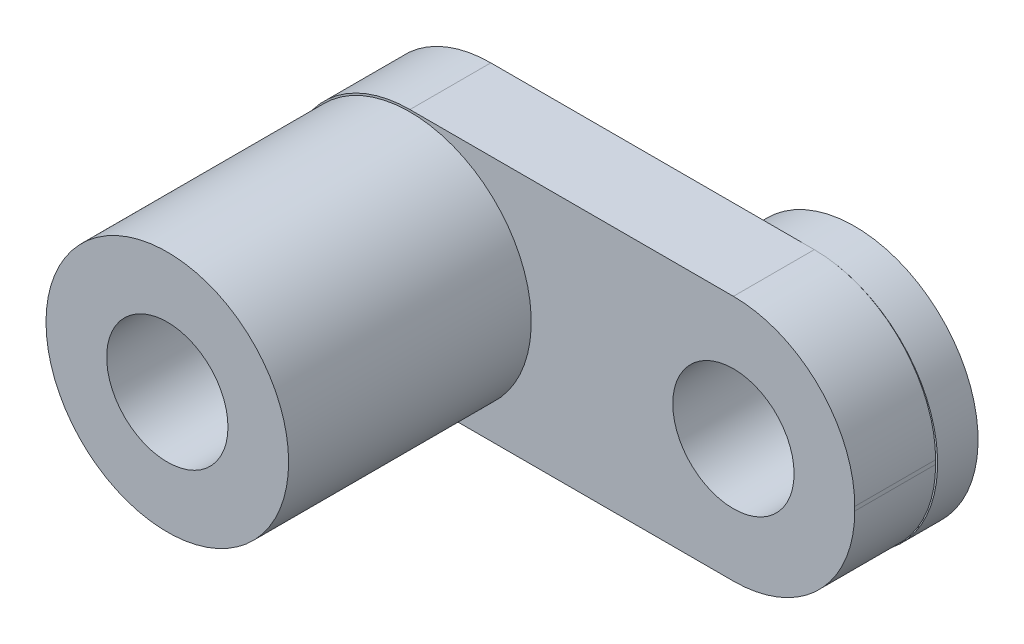
ISO-10303-21;
HEADER;
FILE_DESCRIPTION(('STEP AP214'),'2;1');
FILE_NAME('part.step','',(''),(''),'','','');
FILE_SCHEMA(('AUTOMOTIVE_DESIGN { 1 0 10303 214 1 1 1 1 }'));
ENDSEC;
DATA;
#1=APPLICATION_CONTEXT('core data for automotive mechanical design processes');
#2=APPLICATION_PROTOCOL_DEFINITION('international standard','automotive_design',2000,#1);
#3=PRODUCT_CONTEXT('',#1,'mechanical');
#4=PRODUCT('Part','Part','',(#3));
#5=PRODUCT_RELATED_PRODUCT_CATEGORY('part','',(#4));
#6=PRODUCT_DEFINITION_FORMATION('','',#4);
#7=PRODUCT_DEFINITION_CONTEXT('part definition',#1,'design');
#8=PRODUCT_DEFINITION('design','',#6,#7);
#9=PRODUCT_DEFINITION_SHAPE('','',#8);
#10=(LENGTH_UNIT() NAMED_UNIT(*) SI_UNIT(.MILLI.,.METRE.));
#11=(NAMED_UNIT(*) PLANE_ANGLE_UNIT() SI_UNIT($,.RADIAN.));
#12=(NAMED_UNIT(*) SI_UNIT($,.STERADIAN.) SOLID_ANGLE_UNIT());
#13=UNCERTAINTY_MEASURE_WITH_UNIT(LENGTH_MEASURE(1.E-05),#10,'distance_accuracy_value','');
#14=(GEOMETRIC_REPRESENTATION_CONTEXT(3) GLOBAL_UNCERTAINTY_ASSIGNED_CONTEXT((#13)) GLOBAL_UNIT_ASSIGNED_CONTEXT((#10,
#11,#12)) REPRESENTATION_CONTEXT('',''));
#15=CARTESIAN_POINT('',(0.,0.,0.));
#16=DIRECTION('',(0.,0.,1.));
#17=DIRECTION('',(1.,0.,0.));
#18=AXIS2_PLACEMENT_3D('',#15,#16,#17);
#19=CARTESIAN_POINT('',(3.,3.1,0.));
#20=DIRECTION('',(0.,0.,-1.));
#21=DIRECTION('',(-1.,0.,0.));
#22=AXIS2_PLACEMENT_3D('',#19,#20,#21);
#23=PLANE('',#22);
#24=CARTESIAN_POINT('',(3.,3.05,0.));
#25=DIRECTION('',(0.,0.,-1.));
#26=DIRECTION('',(-1.,0.,0.));
#27=AXIS2_PLACEMENT_3D('',#24,#25,#26);
#28=CIRCLE('',#27,1.5);
#29=CARTESIAN_POINT('',(1.5,3.05,0.));
#30=VERTEX_POINT('',#29);
#31=EDGE_CURVE('E118',#30,#30,#28,.T.);
#32=ORIENTED_EDGE('',*,*,#31,.F.);
#33=EDGE_LOOP('',(#32));
#34=FACE_BOUND('',#33,.T.);
#35=DIRECTION('',(-1.,0.,0.));
#36=VECTOR('',#35,1.);
#37=CARTESIAN_POINT('',(3.00000000000002,6.1,0.));
#38=LINE('',#37,#36);
#39=CARTESIAN_POINT('',(11.,6.1,0.));
#40=VERTEX_POINT('',#39);
#41=CARTESIAN_POINT('',(3.00000000000002,6.1,0.));
#42=VERTEX_POINT('',#41);
#43=EDGE_CURVE('E127',#40,#42,#38,.T.);
#44=ORIENTED_EDGE('',*,*,#43,.F.);
#45=CARTESIAN_POINT('',(11.,3.05,0.));
#46=DIRECTION('',(0.,0.,-1.));
#47=DIRECTION('',(-1.,0.,0.));
#48=AXIS2_PLACEMENT_3D('',#45,#46,#47);
#49=CIRCLE('',#48,3.05);
#50=CARTESIAN_POINT('',(11.,0.,0.));
#51=VERTEX_POINT('',#50);
#52=EDGE_CURVE('E11',#40,#51,#49,.F.);
#53=ORIENTED_EDGE('',*,*,#52,.T.);
#54=DIRECTION('',(1.,0.,0.));
#55=VECTOR('',#54,1.);
#56=CARTESIAN_POINT('',(3.00000000000002,0.,0.));
#57=LINE('',#56,#55);
#58=CARTESIAN_POINT('',(3.00000000000002,0.,0.));
#59=VERTEX_POINT('',#58);
#60=EDGE_CURVE('E188',#59,#51,#57,.T.);
#61=ORIENTED_EDGE('',*,*,#60,.F.);
#62=CARTESIAN_POINT('',(3.,3.,0.));
#63=DIRECTION('',(0.,0.,1.));
#64=DIRECTION('',(-1.,0.,0.));
#65=AXIS2_PLACEMENT_3D('',#62,#63,#64);
#66=CIRCLE('',#65,3.);
#67=CARTESIAN_POINT('',(0.,3.00000000000002,0.));
#68=VERTEX_POINT('',#67);
#69=EDGE_CURVE('E180',#68,#59,#66,.T.);
#70=ORIENTED_EDGE('',*,*,#69,.F.);
#71=DIRECTION('',(0.,-1.,0.));
#72=VECTOR('',#71,1.);
#73=CARTESIAN_POINT('',(0.,3.00000000000002,0.));
#74=LINE('',#73,#72);
#75=CARTESIAN_POINT('',(0.,3.09999999999998,0.));
#76=VERTEX_POINT('',#75);
#77=EDGE_CURVE('E174',#76,#68,#74,.T.);
#78=ORIENTED_EDGE('',*,*,#77,.F.);
#79=CARTESIAN_POINT('',(3.,3.1,0.));
#80=DIRECTION('',(0.,0.,1.));
#81=DIRECTION('',(-1.,0.,0.));
#82=AXIS2_PLACEMENT_3D('',#79,#80,#81);
#83=CIRCLE('',#82,3.);
#84=EDGE_CURVE('E137',#42,#76,#83,.T.);
#85=ORIENTED_EDGE('',*,*,#84,.F.);
#86=EDGE_LOOP('',(#44,#53,#61,#70,#78,#85));
#87=FACE_BOUND('',#86,.T.);
#88=ADVANCED_FACE('F36',(#34,#87),#23,.T.);
#89=CARTESIAN_POINT('',(3.,3.1,2.));
#90=DIRECTION('',(0.,0.,-1.));
#91=DIRECTION('',(-1.,0.,0.));
#92=AXIS2_PLACEMENT_3D('',#89,#90,#91);
#93=PLANE('',#92);
#94=CARTESIAN_POINT('',(11.,3.05,2.));
#95=DIRECTION('',(0.,0.,-1.));
#96=DIRECTION('',(-1.,0.,0.));
#97=AXIS2_PLACEMENT_3D('',#94,#95,#96);
#98=CIRCLE('',#97,1.5);
#99=CARTESIAN_POINT('',(9.5,3.05,2.));
#100=VERTEX_POINT('',#99);
#101=EDGE_CURVE('E218',#100,#100,#98,.T.);
#102=ORIENTED_EDGE('',*,*,#101,.T.);
#103=EDGE_LOOP('',(#102));
#104=FACE_BOUND('',#103,.T.);
#105=DIRECTION('',(0.,-1.,0.));
#106=VECTOR('',#105,1.);
#107=CARTESIAN_POINT('',(0.,3.00000000000002,2.));
#108=LINE('',#107,#106);
#109=CARTESIAN_POINT('',(0.,3.09999999999998,2.));
#110=VERTEX_POINT('',#109);
#111=CARTESIAN_POINT('',(0.,3.05,2.));
#112=VERTEX_POINT('',#111);
#113=EDGE_CURVE('E144',#110,#112,#108,.T.);
#114=ORIENTED_EDGE('',*,*,#113,.T.);
#115=CARTESIAN_POINT('',(3.,3.05,2.));
#116=DIRECTION('',(0.,0.,1.));
#117=DIRECTION('',(1.,0.,0.));
#118=AXIS2_PLACEMENT_3D('',#115,#116,#117);
#119=CIRCLE('',#118,3.);
#120=EDGE_CURVE('E183',#112,#112,#119,.T.);
#121=ORIENTED_EDGE('',*,*,#120,.F.);
#122=CARTESIAN_POINT('',(0.,3.00000000000002,2.));
#123=VERTEX_POINT('',#122);
#124=EDGE_CURVE('E140',#112,#123,#108,.T.);
#125=ORIENTED_EDGE('',*,*,#124,.T.);
#126=CARTESIAN_POINT('',(3.,3.,2.));
#127=DIRECTION('',(0.,0.,1.));
#128=DIRECTION('',(-1.,0.,0.));
#129=AXIS2_PLACEMENT_3D('',#126,#127,#128);
#130=CIRCLE('',#129,3.);
#131=CARTESIAN_POINT('',(3.00000000000002,0.,2.));
#132=VERTEX_POINT('',#131);
#133=EDGE_CURVE('E146',#123,#132,#130,.T.);
#134=ORIENTED_EDGE('',*,*,#133,.T.);
#135=DIRECTION('',(1.,0.,0.));
#136=VECTOR('',#135,1.);
#137=CARTESIAN_POINT('',(3.00000000000002,0.,2.));
#138=LINE('',#137,#136);
#139=CARTESIAN_POINT('',(11.,0.,2.));
#140=VERTEX_POINT('',#139);
#141=EDGE_CURVE('E148',#132,#140,#138,.T.);
#142=ORIENTED_EDGE('',*,*,#141,.T.);
#143=CARTESIAN_POINT('',(11.,3.,2.));
#144=DIRECTION('',(0.,0.,1.));
#145=DIRECTION('',(1.,0.,0.));
#146=AXIS2_PLACEMENT_3D('',#143,#144,#145);
#147=CIRCLE('',#146,3.);
#148=CARTESIAN_POINT('',(14.,3.00000000000002,2.));
#149=VERTEX_POINT('',#148);
#150=EDGE_CURVE('E150',#140,#149,#147,.T.);
#151=ORIENTED_EDGE('',*,*,#150,.T.);
#152=DIRECTION('',(0.,1.,0.));
#153=VECTOR('',#152,1.);
#154=CARTESIAN_POINT('',(14.,3.00000000000002,2.));
#155=LINE('',#154,#153);
#156=CARTESIAN_POINT('',(14.,3.09999999999998,2.));
#157=VERTEX_POINT('',#156);
#158=EDGE_CURVE('E152',#149,#157,#155,.T.);
#159=ORIENTED_EDGE('',*,*,#158,.T.);
#160=CARTESIAN_POINT('',(11.,3.1,2.));
#161=DIRECTION('',(0.,0.,1.));
#162=DIRECTION('',(-1.,0.,0.));
#163=AXIS2_PLACEMENT_3D('',#160,#161,#162);
#164=CIRCLE('',#163,3.);
#165=CARTESIAN_POINT('',(11.,6.1,2.));
#166=VERTEX_POINT('',#165);
#167=EDGE_CURVE('E56',#157,#166,#164,.T.);
#168=ORIENTED_EDGE('',*,*,#167,.T.);
#169=DIRECTION('',(-1.,0.,0.));
#170=VECTOR('',#169,1.);
#171=CARTESIAN_POINT('',(3.00000000000002,6.1,2.));
#172=LINE('',#171,#170);
#173=CARTESIAN_POINT('',(3.00000000000002,6.1,2.));
#174=VERTEX_POINT('',#173);
#175=EDGE_CURVE('E51',#166,#174,#172,.T.);
#176=ORIENTED_EDGE('',*,*,#175,.T.);
#177=CARTESIAN_POINT('',(3.,3.1,2.));
#178=DIRECTION('',(0.,0.,1.));
#179=DIRECTION('',(-1.,0.,0.));
#180=AXIS2_PLACEMENT_3D('',#177,#178,#179);
#181=CIRCLE('',#180,3.);
#182=EDGE_CURVE('E138',#174,#110,#181,.T.);
#183=ORIENTED_EDGE('',*,*,#182,.T.);
#184=EDGE_LOOP('',(#114,#121,#125,#134,#142,#151,#159,#168,#176,#183));
#185=FACE_BOUND('',#184,.T.);
#186=ADVANCED_FACE('F208',(#104,#185),#93,.F.);
#187=CARTESIAN_POINT('',(3.,3.1,2.));
#188=DIRECTION('',(0.,0.,-1.));
#189=DIRECTION('',(-1.,0.,0.));
#190=AXIS2_PLACEMENT_3D('',#187,#188,#189);
#191=CYLINDRICAL_SURFACE('',#190,3.);
#192=ORIENTED_EDGE('',*,*,#84,.T.);
#193=DIRECTION('',(0.,0.,-1.));
#194=VECTOR('',#193,1.);
#195=CARTESIAN_POINT('',(0.,3.09999999999998,2.));
#196=LINE('',#195,#194);
#197=EDGE_CURVE('E44',#110,#76,#196,.T.);
#198=ORIENTED_EDGE('',*,*,#197,.F.);
#199=ORIENTED_EDGE('',*,*,#182,.F.);
#200=DIRECTION('',(0.,0.,-1.));
#201=VECTOR('',#200,1.);
#202=CARTESIAN_POINT('',(3.00000000000002,6.1,2.));
#203=LINE('',#202,#201);
#204=EDGE_CURVE('E133',#174,#42,#203,.T.);
#205=ORIENTED_EDGE('',*,*,#204,.T.);
#206=EDGE_LOOP('',(#192,#198,#199,#205));
#207=FACE_BOUND('',#206,.T.);
#208=ADVANCED_FACE('F38',(#207),#191,.T.);
#209=CARTESIAN_POINT('',(0.,3.00000000000002,2.));
#210=DIRECTION('',(1.,0.,0.));
#211=DIRECTION('',(0.,0.,-1.));
#212=AXIS2_PLACEMENT_3D('',#209,#210,#211);
#213=PLANE('',#212);
#214=ORIENTED_EDGE('',*,*,#77,.T.);
#215=DIRECTION('',(0.,0.,-1.));
#216=VECTOR('',#215,1.);
#217=CARTESIAN_POINT('',(0.,3.00000000000002,2.));
#218=LINE('',#217,#216);
#219=EDGE_CURVE('E167',#123,#68,#218,.T.);
#220=ORIENTED_EDGE('',*,*,#219,.F.);
#221=ORIENTED_EDGE('',*,*,#124,.F.);
#222=ORIENTED_EDGE('',*,*,#113,.F.);
#223=ORIENTED_EDGE('',*,*,#197,.T.);
#224=EDGE_LOOP('',(#214,#220,#221,#222,#223));
#225=FACE_BOUND('',#224,.T.);
#226=ADVANCED_FACE('F172',(#225),#213,.F.);
#227=CARTESIAN_POINT('',(3.,3.,2.));
#228=DIRECTION('',(0.,0.,-1.));
#229=DIRECTION('',(-1.,0.,0.));
#230=AXIS2_PLACEMENT_3D('',#227,#228,#229);
#231=CYLINDRICAL_SURFACE('',#230,3.);
#232=ORIENTED_EDGE('',*,*,#69,.T.);
#233=DIRECTION('',(0.,0.,-1.));
#234=VECTOR('',#233,1.);
#235=CARTESIAN_POINT('',(3.00000000000002,0.,2.));
#236=LINE('',#235,#234);
#237=EDGE_CURVE('E164',#132,#59,#236,.T.);
#238=ORIENTED_EDGE('',*,*,#237,.F.);
#239=ORIENTED_EDGE('',*,*,#133,.F.);
#240=ORIENTED_EDGE('',*,*,#219,.T.);
#241=EDGE_LOOP('',(#232,#238,#239,#240));
#242=FACE_BOUND('',#241,.T.);
#243=ADVANCED_FACE('F204',(#242),#231,.T.);
#244=CARTESIAN_POINT('',(3.00000000000002,0.,2.));
#245=DIRECTION('',(0.,1.,0.));
#246=DIRECTION('',(0.,0.,1.));
#247=AXIS2_PLACEMENT_3D('',#244,#245,#246);
#248=PLANE('',#247);
#249=ORIENTED_EDGE('',*,*,#60,.T.);
#250=DIRECTION('',(0.,0.,-1.));
#251=VECTOR('',#250,1.);
#252=CARTESIAN_POINT('',(11.,0.,2.));
#253=LINE('',#252,#251);
#254=EDGE_CURVE('E161',#140,#51,#253,.T.);
#255=ORIENTED_EDGE('',*,*,#254,.F.);
#256=ORIENTED_EDGE('',*,*,#141,.F.);
#257=ORIENTED_EDGE('',*,*,#237,.T.);
#258=EDGE_LOOP('',(#249,#255,#256,#257));
#259=FACE_BOUND('',#258,.T.);
#260=ADVANCED_FACE('F200',(#259),#248,.F.);
#261=CARTESIAN_POINT('',(11.,3.,2.));
#262=DIRECTION('',(0.,0.,-1.));
#263=DIRECTION('',(-1.,0.,0.));
#264=AXIS2_PLACEMENT_3D('',#261,#262,#263);
#265=CYLINDRICAL_SURFACE('',#264,3.);
#266=CARTESIAN_POINT('',(11.,3.,0.));
#267=DIRECTION('',(0.,0.,1.));
#268=DIRECTION('',(1.,0.,0.));
#269=AXIS2_PLACEMENT_3D('',#266,#267,#268);
#270=CIRCLE('',#269,3.);
#271=CARTESIAN_POINT('',(14.,3.00000000000002,0.));
#272=VERTEX_POINT('',#271);
#273=EDGE_CURVE('E116',#51,#272,#270,.T.);
#274=ORIENTED_EDGE('',*,*,#273,.T.);
#275=DIRECTION('',(0.,0.,-1.));
#276=VECTOR('',#275,1.);
#277=CARTESIAN_POINT('',(14.,3.00000000000002,2.));
#278=LINE('',#277,#276);
#279=EDGE_CURVE('E158',#149,#272,#278,.T.);
#280=ORIENTED_EDGE('',*,*,#279,.F.);
#281=ORIENTED_EDGE('',*,*,#150,.F.);
#282=ORIENTED_EDGE('',*,*,#254,.T.);
#283=EDGE_LOOP('',(#274,#280,#281,#282));
#284=FACE_BOUND('',#283,.T.);
#285=ADVANCED_FACE('F195',(#284),#265,.T.);
#286=CARTESIAN_POINT('',(14.,3.00000000000002,2.));
#287=DIRECTION('',(-1.,0.,0.));
#288=DIRECTION('',(0.,0.,1.));
#289=AXIS2_PLACEMENT_3D('',#286,#287,#288);
#290=PLANE('',#289);
#291=DIRECTION('',(0.,1.,0.));
#292=VECTOR('',#291,1.);
#293=CARTESIAN_POINT('',(14.,3.00000000000002,0.));
#294=LINE('',#293,#292);
#295=CARTESIAN_POINT('',(14.,3.09999999999998,0.));
#296=VERTEX_POINT('',#295);
#297=EDGE_CURVE('E128',#272,#296,#294,.T.);
#298=ORIENTED_EDGE('',*,*,#297,.T.);
#299=DIRECTION('',(0.,0.,-1.));
#300=VECTOR('',#299,1.);
#301=CARTESIAN_POINT('',(14.,3.09999999999998,2.));
#302=LINE('',#301,#300);
#303=EDGE_CURVE('E126',#157,#296,#302,.T.);
#304=ORIENTED_EDGE('',*,*,#303,.F.);
#305=ORIENTED_EDGE('',*,*,#158,.F.);
#306=ORIENTED_EDGE('',*,*,#279,.T.);
#307=EDGE_LOOP('',(#298,#304,#305,#306));
#308=FACE_BOUND('',#307,.T.);
#309=ADVANCED_FACE('F191',(#308),#290,.F.);
#310=CARTESIAN_POINT('',(11.,3.1,2.));
#311=DIRECTION('',(0.,0.,-1.));
#312=DIRECTION('',(-1.,0.,0.));
#313=AXIS2_PLACEMENT_3D('',#310,#311,#312);
#314=CYLINDRICAL_SURFACE('',#313,3.);
#315=CARTESIAN_POINT('',(11.,3.1,0.));
#316=DIRECTION('',(0.,0.,1.));
#317=DIRECTION('',(-1.,0.,0.));
#318=AXIS2_PLACEMENT_3D('',#315,#316,#317);
#319=CIRCLE('',#318,3.);
#320=EDGE_CURVE('E113',#296,#40,#319,.T.);
#321=ORIENTED_EDGE('',*,*,#320,.T.);
#322=DIRECTION('',(0.,0.,-1.));
#323=VECTOR('',#322,1.);
#324=CARTESIAN_POINT('',(11.,6.1,2.));
#325=LINE('',#324,#323);
#326=EDGE_CURVE('E124',#166,#40,#325,.T.);
#327=ORIENTED_EDGE('',*,*,#326,.F.);
#328=ORIENTED_EDGE('',*,*,#167,.F.);
#329=ORIENTED_EDGE('',*,*,#303,.T.);
#330=EDGE_LOOP('',(#321,#327,#328,#329));
#331=FACE_BOUND('',#330,.T.);
#332=ADVANCED_FACE('F123',(#331),#314,.T.);
#333=CARTESIAN_POINT('',(3.00000000000002,6.1,2.));
#334=DIRECTION('',(0.,-1.,0.));
#335=DIRECTION('',(0.,0.,-1.));
#336=AXIS2_PLACEMENT_3D('',#333,#334,#335);
#337=PLANE('',#336);
#338=ORIENTED_EDGE('',*,*,#43,.T.);
#339=ORIENTED_EDGE('',*,*,#204,.F.);
#340=ORIENTED_EDGE('',*,*,#175,.F.);
#341=ORIENTED_EDGE('',*,*,#326,.T.);
#342=EDGE_LOOP('',(#338,#339,#340,#341));
#343=FACE_BOUND('',#342,.T.);
#344=ADVANCED_FACE('F131',(#343),#337,.F.);
#345=CARTESIAN_POINT('',(3.,3.05,8.));
#346=DIRECTION('',(0.,0.,-1.));
#347=DIRECTION('',(-1.,0.,0.));
#348=AXIS2_PLACEMENT_3D('',#345,#346,#347);
#349=CYLINDRICAL_SURFACE('',#348,3.);
#350=CARTESIAN_POINT('',(3.,3.05,8.));
#351=DIRECTION('',(0.,0.,1.));
#352=DIRECTION('',(1.,0.,0.));
#353=AXIS2_PLACEMENT_3D('',#350,#351,#352);
#354=CIRCLE('',#353,3.);
#355=CARTESIAN_POINT('',(6.,3.05,8.));
#356=VERTEX_POINT('',#355);
#357=EDGE_CURVE('E178',#356,#356,#354,.T.);
#358=ORIENTED_EDGE('',*,*,#357,.F.);
#359=EDGE_LOOP('',(#358));
#360=FACE_BOUND('',#359,.T.);
#361=ORIENTED_EDGE('',*,*,#120,.T.);
#362=EDGE_LOOP('',(#361));
#363=FACE_BOUND('',#362,.T.);
#364=ADVANCED_FACE('F247',(#360,#363),#349,.T.);
#365=CARTESIAN_POINT('',(3.,3.05,8.));
#366=DIRECTION('',(0.,0.,1.));
#367=DIRECTION('',(1.,0.,0.));
#368=AXIS2_PLACEMENT_3D('',#365,#366,#367);
#369=PLANE('',#368);
#370=CARTESIAN_POINT('',(3.,3.05,8.));
#371=DIRECTION('',(0.,0.,1.));
#372=DIRECTION('',(1.,0.,0.));
#373=AXIS2_PLACEMENT_3D('',#370,#371,#372);
#374=CIRCLE('',#373,1.5);
#375=CARTESIAN_POINT('',(4.5,3.05,8.));
#376=VERTEX_POINT('',#375);
#377=EDGE_CURVE('E215',#376,#376,#374,.T.);
#378=ORIENTED_EDGE('',*,*,#377,.F.);
#379=EDGE_LOOP('',(#378));
#380=FACE_BOUND('',#379,.T.);
#381=ORIENTED_EDGE('',*,*,#357,.T.);
#382=EDGE_LOOP('',(#381));
#383=FACE_BOUND('',#382,.T.);
#384=ADVANCED_FACE('F293',(#380,#383),#369,.T.);
#385=CARTESIAN_POINT('',(11.,3.05,0.));
#386=DIRECTION('',(0.,0.,-1.));
#387=DIRECTION('',(-1.,0.,0.));
#388=AXIS2_PLACEMENT_3D('',#385,#386,#387);
#389=PLANE('',#388);
#390=ORIENTED_EDGE('',*,*,#297,.F.);
#391=ORIENTED_EDGE('',*,*,#273,.F.);
#392=CARTESIAN_POINT('',(11.,3.05,0.));
#393=DIRECTION('',(0.,0.,-1.));
#394=DIRECTION('',(-1.,0.,0.));
#395=AXIS2_PLACEMENT_3D('',#392,#393,#394);
#396=CIRCLE('',#395,3.05);
#397=EDGE_CURVE('E104',#40,#51,#396,.T.);
#398=ORIENTED_EDGE('',*,*,#397,.F.);
#399=ORIENTED_EDGE('',*,*,#320,.F.);
#400=EDGE_LOOP('',(#390,#391,#398,#399));
#401=FACE_BOUND('',#400,.T.);
#402=ADVANCED_FACE('F112',(#401),#389,.F.);
#403=CARTESIAN_POINT('',(11.,3.05,-1.));
#404=DIRECTION('',(0.,0.,1.));
#405=DIRECTION('',(1.,0.,0.));
#406=AXIS2_PLACEMENT_3D('',#403,#404,#405);
#407=CYLINDRICAL_SURFACE('',#406,3.05);
#408=CARTESIAN_POINT('',(11.,3.05,-1.));
#409=DIRECTION('',(0.,0.,-1.));
#410=DIRECTION('',(-1.,0.,0.));
#411=AXIS2_PLACEMENT_3D('',#408,#409,#410);
#412=CIRCLE('',#411,3.05);
#413=CARTESIAN_POINT('',(7.95,3.05,-1.));
#414=VERTEX_POINT('',#413);
#415=EDGE_CURVE('E117',#414,#414,#412,.T.);
#416=ORIENTED_EDGE('',*,*,#415,.F.);
#417=EDGE_LOOP('',(#416));
#418=FACE_BOUND('',#417,.T.);
#419=ORIENTED_EDGE('',*,*,#397,.T.);
#420=ORIENTED_EDGE('',*,*,#52,.F.);
#421=EDGE_LOOP('',(#419,#420));
#422=FACE_BOUND('',#421,.T.);
#423=ADVANCED_FACE('F103',(#418,#422),#407,.T.);
#424=CARTESIAN_POINT('',(11.,3.05,-1.));
#425=DIRECTION('',(0.,0.,-1.));
#426=DIRECTION('',(-1.,0.,0.));
#427=AXIS2_PLACEMENT_3D('',#424,#425,#426);
#428=PLANE('',#427);
#429=CARTESIAN_POINT('',(11.,3.05,-1.));
#430=DIRECTION('',(0.,0.,1.));
#431=DIRECTION('',(1.,0.,0.));
#432=AXIS2_PLACEMENT_3D('',#429,#430,#431);
#433=CIRCLE('',#432,1.5);
#434=CARTESIAN_POINT('',(12.5,3.05,-1.));
#435=VERTEX_POINT('',#434);
#436=EDGE_CURVE('E221',#435,#435,#433,.T.);
#437=ORIENTED_EDGE('',*,*,#436,.T.);
#438=EDGE_LOOP('',(#437));
#439=FACE_BOUND('',#438,.T.);
#440=ORIENTED_EDGE('',*,*,#415,.T.);
#441=EDGE_LOOP('',(#440));
#442=FACE_BOUND('',#441,.T.);
#443=ADVANCED_FACE('F225',(#439,#442),#428,.T.);
#444=CARTESIAN_POINT('',(3.,3.05,-1.));
#445=DIRECTION('',(0.,0.,1.));
#446=DIRECTION('',(1.,0.,0.));
#447=AXIS2_PLACEMENT_3D('',#444,#445,#446);
#448=CYLINDRICAL_SURFACE('',#447,1.5);
#449=ORIENTED_EDGE('',*,*,#31,.T.);
#450=EDGE_LOOP('',(#449));
#451=FACE_BOUND('',#450,.T.);
#452=ORIENTED_EDGE('',*,*,#377,.T.);
#453=EDGE_LOOP('',(#452));
#454=FACE_BOUND('',#453,.T.);
#455=ADVANCED_FACE('F231',(#451,#454),#448,.F.);
#456=CARTESIAN_POINT('',(11.,3.05,-1.));
#457=DIRECTION('',(0.,0.,1.));
#458=DIRECTION('',(1.,0.,0.));
#459=AXIS2_PLACEMENT_3D('',#456,#457,#458);
#460=CYLINDRICAL_SURFACE('',#459,1.5);
#461=ORIENTED_EDGE('',*,*,#436,.F.);
#462=EDGE_LOOP('',(#461));
#463=FACE_BOUND('',#462,.T.);
#464=ORIENTED_EDGE('',*,*,#101,.F.);
#465=EDGE_LOOP('',(#464));
#466=FACE_BOUND('',#465,.T.);
#467=ADVANCED_FACE('F228',(#463,#466),#460,.F.);
#468=CLOSED_SHELL('',(#88,#186,#208,#226,#243,#260,#285,#309,#332,#344,#364,#384,#402,#423,#443,
#455,#467));
#469=MANIFOLD_SOLID_BREP('B2',#468);
#470=ADVANCED_BREP_SHAPE_REPRESENTATION('',(#18,#469),#14);
#471=SHAPE_DEFINITION_REPRESENTATION(#9,#470);
ENDSEC;
END-ISO-10303-21;
